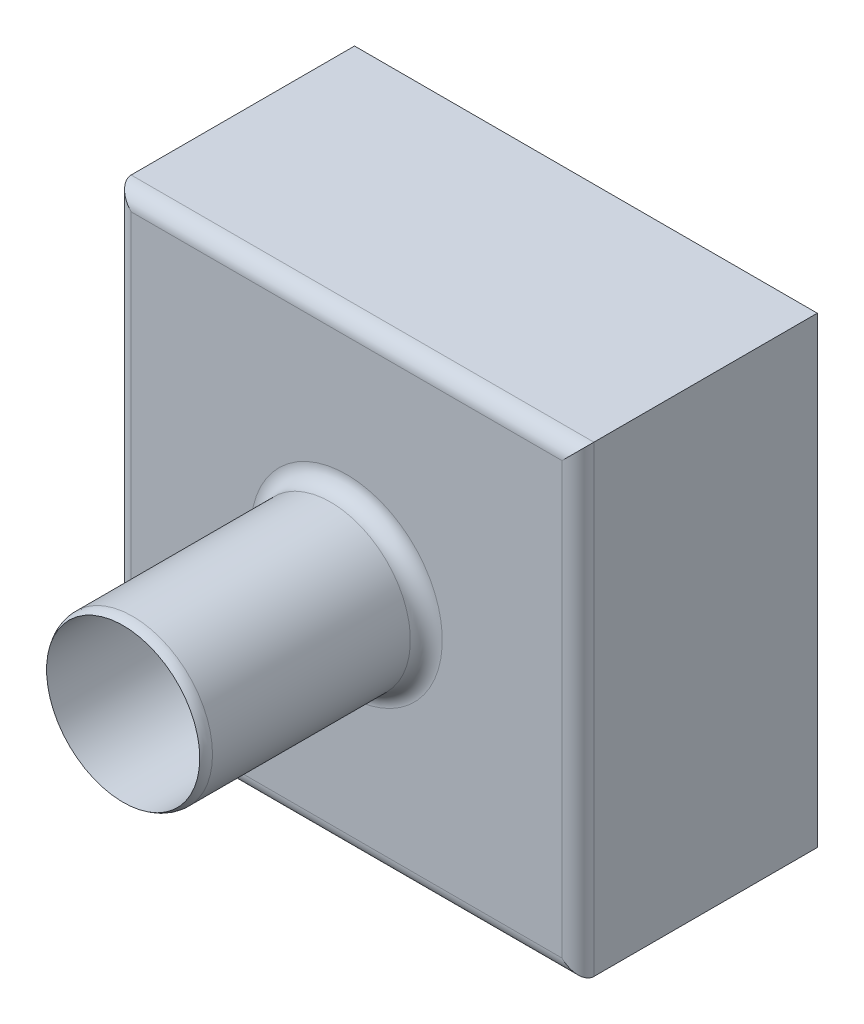
ISO-10303-21;
HEADER;
FILE_DESCRIPTION(('STEP AP214'),'2;1');
FILE_NAME('part.step','',(''),(''),'','','');
FILE_SCHEMA(('AUTOMOTIVE_DESIGN { 1 0 10303 214 1 1 1 1 }'));
ENDSEC;
DATA;
#1=APPLICATION_CONTEXT('core data for automotive mechanical design processes');
#2=APPLICATION_PROTOCOL_DEFINITION('international standard','automotive_design',2000,#1);
#3=PRODUCT_CONTEXT('',#1,'mechanical');
#4=PRODUCT('Part','Part','',(#3));
#5=PRODUCT_RELATED_PRODUCT_CATEGORY('part','',(#4));
#6=PRODUCT_DEFINITION_FORMATION('','',#4);
#7=PRODUCT_DEFINITION_CONTEXT('part definition',#1,'design');
#8=PRODUCT_DEFINITION('design','',#6,#7);
#9=PRODUCT_DEFINITION_SHAPE('','',#8);
#10=(LENGTH_UNIT() NAMED_UNIT(*) SI_UNIT(.MILLI.,.METRE.));
#11=(NAMED_UNIT(*) PLANE_ANGLE_UNIT() SI_UNIT($,.RADIAN.));
#12=(NAMED_UNIT(*) SI_UNIT($,.STERADIAN.) SOLID_ANGLE_UNIT());
#13=UNCERTAINTY_MEASURE_WITH_UNIT(LENGTH_MEASURE(1.E-05),#10,'distance_accuracy_value','');
#14=(GEOMETRIC_REPRESENTATION_CONTEXT(3) GLOBAL_UNCERTAINTY_ASSIGNED_CONTEXT((#13)) GLOBAL_UNIT_ASSIGNED_CONTEXT((#10,
#11,#12)) REPRESENTATION_CONTEXT('',''));
#15=CARTESIAN_POINT('',(0.,0.,0.));
#16=DIRECTION('',(0.,0.,1.));
#17=DIRECTION('',(1.,0.,0.));
#18=AXIS2_PLACEMENT_3D('',#15,#16,#17);
#19=CARTESIAN_POINT('',(0.,0.,15.));
#20=DIRECTION('',(-1.,0.,0.));
#21=DIRECTION('',(0.,-1.,0.));
#22=AXIS2_PLACEMENT_3D('',#19,#20,#21);
#23=PLANE('',#22);
#24=DIRECTION('',(0.,0.,-1.));
#25=VECTOR('',#24,1.);
#26=CARTESIAN_POINT('',(0.,0.,15.));
#27=LINE('',#26,#25);
#28=CARTESIAN_POINT('',(0.,0.,14.));
#29=VERTEX_POINT('',#28);
#30=CARTESIAN_POINT('',(0.,0.,0.));
#31=VERTEX_POINT('',#30);
#32=EDGE_CURVE('E178',#29,#31,#27,.T.);
#33=ORIENTED_EDGE('',*,*,#32,.F.);
#34=DIRECTION('',(0.,1.,0.));
#35=VECTOR('',#34,1.);
#36=CARTESIAN_POINT('',(0.,0.,14.));
#37=LINE('',#36,#35);
#38=CARTESIAN_POINT('',(0.,-29.,14.));
#39=VERTEX_POINT('',#38);
#40=EDGE_CURVE('E11',#29,#39,#37,.F.);
#41=ORIENTED_EDGE('',*,*,#40,.T.);
#42=DIRECTION('',(0.,0.,-1.));
#43=VECTOR('',#42,1.);
#44=CARTESIAN_POINT('',(0.,-29.,15.));
#45=LINE('',#44,#43);
#46=CARTESIAN_POINT('',(0.,-29.,0.));
#47=VERTEX_POINT('',#46);
#48=EDGE_CURVE('E200',#39,#47,#45,.T.);
#49=ORIENTED_EDGE('',*,*,#48,.T.);
#50=DIRECTION('',(0.,1.,0.));
#51=VECTOR('',#50,1.);
#52=CARTESIAN_POINT('',(0.,0.,0.));
#53=LINE('',#52,#51);
#54=EDGE_CURVE('E194',#47,#31,#53,.T.);
#55=ORIENTED_EDGE('',*,*,#54,.T.);
#56=EDGE_LOOP('',(#33,#41,#49,#55));
#57=FACE_BOUND('',#56,.T.);
#58=ADVANCED_FACE('F41',(#57),#23,.F.);
#59=CARTESIAN_POINT('',(0.,0.,15.));
#60=DIRECTION('',(0.,-1.,0.));
#61=DIRECTION('',(1.,0.,0.));
#62=AXIS2_PLACEMENT_3D('',#59,#60,#61);
#63=PLANE('',#62);
#64=DIRECTION('',(0.,0.,-1.));
#65=VECTOR('',#64,1.);
#66=CARTESIAN_POINT('',(-28.9999999999999,0.,15.));
#67=LINE('',#66,#65);
#68=CARTESIAN_POINT('',(-28.9999999999999,0.,14.));
#69=VERTEX_POINT('',#68);
#70=CARTESIAN_POINT('',(-28.9999999999999,0.,0.));
#71=VERTEX_POINT('',#70);
#72=EDGE_CURVE('E188',#69,#71,#67,.T.);
#73=ORIENTED_EDGE('',*,*,#72,.F.);
#74=DIRECTION('',(-1.,0.,0.));
#75=VECTOR('',#74,1.);
#76=CARTESIAN_POINT('',(0.,0.,14.));
#77=LINE('',#76,#75);
#78=EDGE_CURVE('E51',#69,#29,#77,.F.);
#79=ORIENTED_EDGE('',*,*,#78,.T.);
#80=ORIENTED_EDGE('',*,*,#32,.T.);
#81=DIRECTION('',(-1.,0.,0.));
#82=VECTOR('',#81,1.);
#83=CARTESIAN_POINT('',(0.,0.,0.));
#84=LINE('',#83,#82);
#85=EDGE_CURVE('E181',#31,#71,#84,.T.);
#86=ORIENTED_EDGE('',*,*,#85,.T.);
#87=EDGE_LOOP('',(#73,#79,#80,#86));
#88=FACE_BOUND('',#87,.T.);
#89=ADVANCED_FACE('F180',(#88),#63,.F.);
#90=CARTESIAN_POINT('',(-28.9999999999999,0.,15.));
#91=DIRECTION('',(1.,0.,0.));
#92=DIRECTION('',(0.,1.,0.));
#93=AXIS2_PLACEMENT_3D('',#90,#91,#92);
#94=PLANE('',#93);
#95=DIRECTION('',(0.,0.,-1.));
#96=VECTOR('',#95,1.);
#97=CARTESIAN_POINT('',(-28.9999999999999,-29.,15.));
#98=LINE('',#97,#96);
#99=CARTESIAN_POINT('',(-28.9999999999999,-29.,14.));
#100=VERTEX_POINT('',#99);
#101=CARTESIAN_POINT('',(-28.9999999999999,-29.,0.));
#102=VERTEX_POINT('',#101);
#103=EDGE_CURVE('E220',#100,#102,#98,.T.);
#104=ORIENTED_EDGE('',*,*,#103,.F.);
#105=DIRECTION('',(0.,-1.,0.));
#106=VECTOR('',#105,1.);
#107=CARTESIAN_POINT('',(-28.9999999999999,0.,14.));
#108=LINE('',#107,#106);
#109=EDGE_CURVE('E66',#100,#69,#108,.F.);
#110=ORIENTED_EDGE('',*,*,#109,.T.);
#111=ORIENTED_EDGE('',*,*,#72,.T.);
#112=DIRECTION('',(0.,-1.,0.));
#113=VECTOR('',#112,1.);
#114=CARTESIAN_POINT('',(-28.9999999999999,0.,0.));
#115=LINE('',#114,#113);
#116=EDGE_CURVE('E196',#71,#102,#115,.T.);
#117=ORIENTED_EDGE('',*,*,#116,.T.);
#118=EDGE_LOOP('',(#104,#110,#111,#117));
#119=FACE_BOUND('',#118,.T.);
#120=ADVANCED_FACE('F492',(#119),#94,.F.);
#121=CARTESIAN_POINT('',(0.,-29.,15.));
#122=DIRECTION('',(0.,1.,0.));
#123=DIRECTION('',(0.,0.,1.));
#124=AXIS2_PLACEMENT_3D('',#121,#122,#123);
#125=PLANE('',#124);
#126=ORIENTED_EDGE('',*,*,#48,.F.);
#127=DIRECTION('',(1.,0.,0.));
#128=VECTOR('',#127,1.);
#129=CARTESIAN_POINT('',(0.,-29.,14.));
#130=LINE('',#129,#128);
#131=EDGE_CURVE('E437',#39,#100,#130,.F.);
#132=ORIENTED_EDGE('',*,*,#131,.T.);
#133=ORIENTED_EDGE('',*,*,#103,.T.);
#134=DIRECTION('',(1.,0.,0.));
#135=VECTOR('',#134,1.);
#136=CARTESIAN_POINT('',(0.,-29.,0.));
#137=LINE('',#136,#135);
#138=EDGE_CURVE('E215',#102,#47,#137,.T.);
#139=ORIENTED_EDGE('',*,*,#138,.T.);
#140=EDGE_LOOP('',(#126,#132,#133,#139));
#141=FACE_BOUND('',#140,.T.);
#142=ADVANCED_FACE('F598',(#141),#125,.F.);
#143=CARTESIAN_POINT('',(0.,0.,15.));
#144=DIRECTION('',(0.,0.,-1.));
#145=DIRECTION('',(-1.,0.,0.));
#146=AXIS2_PLACEMENT_3D('',#143,#144,#145);
#147=PLANE('',#146);
#148=DIRECTION('',(0.,-1.,0.));
#149=VECTOR('',#148,1.);
#150=CARTESIAN_POINT('',(-27.9999999999999,0.,15.));
#151=LINE('',#150,#149);
#152=CARTESIAN_POINT('',(-27.9999999999999,-1.,15.));
#153=VERTEX_POINT('',#152);
#154=CARTESIAN_POINT('',(-27.9999999999999,-28.,15.));
#155=VERTEX_POINT('',#154);
#156=EDGE_CURVE('E430',#153,#155,#151,.T.);
#157=ORIENTED_EDGE('',*,*,#156,.T.);
#158=DIRECTION('',(1.,0.,0.));
#159=VECTOR('',#158,1.);
#160=CARTESIAN_POINT('',(0.,-28.,15.));
#161=LINE('',#160,#159);
#162=CARTESIAN_POINT('',(-0.999999999999996,-28.,15.));
#163=VERTEX_POINT('',#162);
#164=EDGE_CURVE('E433',#155,#163,#161,.T.);
#165=ORIENTED_EDGE('',*,*,#164,.T.);
#166=DIRECTION('',(0.,1.,0.));
#167=VECTOR('',#166,1.);
#168=CARTESIAN_POINT('',(-1.,0.,15.));
#169=LINE('',#168,#167);
#170=CARTESIAN_POINT('',(-1.,-1.,15.));
#171=VERTEX_POINT('',#170);
#172=EDGE_CURVE('E424',#163,#171,#169,.T.);
#173=ORIENTED_EDGE('',*,*,#172,.T.);
#174=DIRECTION('',(-1.,0.,0.));
#175=VECTOR('',#174,1.);
#176=CARTESIAN_POINT('',(0.,-1.,15.));
#177=LINE('',#176,#175);
#178=EDGE_CURVE('E427',#171,#153,#177,.T.);
#179=ORIENTED_EDGE('',*,*,#178,.T.);
#180=EDGE_LOOP('',(#157,#165,#173,#179));
#181=FACE_BOUND('',#180,.T.);
#182=CARTESIAN_POINT('',(-14.5,-14.5,15.));
#183=DIRECTION('',(0.,0.,-1.));
#184=DIRECTION('',(-1.,0.,0.));
#185=AXIS2_PLACEMENT_3D('',#182,#183,#184);
#186=CIRCLE('',#185,6.);
#187=CARTESIAN_POINT('',(-20.5,-14.5,15.));
#188=VERTEX_POINT('',#187);
#189=EDGE_CURVE('E420',#188,#188,#186,.T.);
#190=ORIENTED_EDGE('',*,*,#189,.T.);
#191=EDGE_LOOP('',(#190));
#192=FACE_BOUND('',#191,.T.);
#193=ADVANCED_FACE('F602',(#181,#192),#147,.F.);
#194=CARTESIAN_POINT('',(0.,0.,0.));
#195=DIRECTION('',(0.,0.,-1.));
#196=DIRECTION('',(-1.,0.,0.));
#197=AXIS2_PLACEMENT_3D('',#194,#195,#196);
#198=PLANE('',#197);
#199=CARTESIAN_POINT('',(-2.5,-6.3,0.));
#200=DIRECTION('',(0.,0.,-1.));
#201=DIRECTION('',(-1.,0.,0.));
#202=AXIS2_PLACEMENT_3D('',#199,#200,#201);
#203=CIRCLE('',#202,2.);
#204=CARTESIAN_POINT('',(-2.5,-4.3,0.));
#205=VERTEX_POINT('',#204);
#206=CARTESIAN_POINT('',(-0.499999999999997,-6.3,0.));
#207=VERTEX_POINT('',#206);
#208=EDGE_CURVE('E298',#205,#207,#203,.T.);
#209=ORIENTED_EDGE('',*,*,#208,.F.);
#210=DIRECTION('',(1.,0.,0.));
#211=VECTOR('',#210,1.);
#212=CARTESIAN_POINT('',(-23.7,-4.3,0.));
#213=LINE('',#212,#211);
#214=CARTESIAN_POINT('',(-22.7,-4.3,0.));
#215=VERTEX_POINT('',#214);
#216=EDGE_CURVE('E322',#205,#215,#213,.F.);
#217=ORIENTED_EDGE('',*,*,#216,.T.);
#218=CARTESIAN_POINT('',(-22.7,-6.3,0.));
#219=DIRECTION('',(0.,0.,-1.));
#220=DIRECTION('',(-1.,0.,0.));
#221=AXIS2_PLACEMENT_3D('',#218,#219,#220);
#222=CIRCLE('',#221,2.);
#223=CARTESIAN_POINT('',(-24.7,-6.3,0.));
#224=VERTEX_POINT('',#223);
#225=EDGE_CURVE('E319',#224,#215,#222,.T.);
#226=ORIENTED_EDGE('',*,*,#225,.F.);
#227=DIRECTION('',(0.,1.,0.));
#228=VECTOR('',#227,1.);
#229=CARTESIAN_POINT('',(-24.7,-27.5,0.));
#230=LINE('',#229,#228);
#231=CARTESIAN_POINT('',(-24.7,-26.5,0.));
#232=VERTEX_POINT('',#231);
#233=EDGE_CURVE('E316',#224,#232,#230,.F.);
#234=ORIENTED_EDGE('',*,*,#233,.T.);
#235=CARTESIAN_POINT('',(-22.7,-26.5,0.));
#236=DIRECTION('',(0.,0.,-1.));
#237=DIRECTION('',(-1.,0.,0.));
#238=AXIS2_PLACEMENT_3D('',#235,#236,#237);
#239=CIRCLE('',#238,2.);
#240=CARTESIAN_POINT('',(-22.7,-28.5,0.));
#241=VERTEX_POINT('',#240);
#242=EDGE_CURVE('E312',#241,#232,#239,.T.);
#243=ORIENTED_EDGE('',*,*,#242,.F.);
#244=DIRECTION('',(-1.,0.,0.));
#245=VECTOR('',#244,1.);
#246=CARTESIAN_POINT('',(-1.5,-28.5,0.));
#247=LINE('',#246,#245);
#248=CARTESIAN_POINT('',(-2.5,-28.5,0.));
#249=VERTEX_POINT('',#248);
#250=EDGE_CURVE('E309',#241,#249,#247,.F.);
#251=ORIENTED_EDGE('',*,*,#250,.T.);
#252=CARTESIAN_POINT('',(-2.5,-26.5,0.));
#253=DIRECTION('',(0.,0.,-1.));
#254=DIRECTION('',(-1.,0.,0.));
#255=AXIS2_PLACEMENT_3D('',#252,#253,#254);
#256=CIRCLE('',#255,2.);
#257=CARTESIAN_POINT('',(-0.499999999999999,-26.5,0.));
#258=VERTEX_POINT('',#257);
#259=EDGE_CURVE('E305',#258,#249,#256,.T.);
#260=ORIENTED_EDGE('',*,*,#259,.F.);
#261=DIRECTION('',(0.,-1.,0.));
#262=VECTOR('',#261,1.);
#263=CARTESIAN_POINT('',(-0.499999999999997,-5.3,0.));
#264=LINE('',#263,#262);
#265=EDGE_CURVE('E302',#258,#207,#264,.F.);
#266=ORIENTED_EDGE('',*,*,#265,.T.);
#267=EDGE_LOOP('',(#209,#217,#226,#234,#243,#251,#260,#266));
#268=FACE_BOUND('',#267,.T.);
#269=ORIENTED_EDGE('',*,*,#54,.F.);
#270=ORIENTED_EDGE('',*,*,#138,.F.);
#271=ORIENTED_EDGE('',*,*,#116,.F.);
#272=ORIENTED_EDGE('',*,*,#85,.F.);
#273=EDGE_LOOP('',(#269,#270,#271,#272));
#274=FACE_BOUND('',#273,.T.);
#275=ADVANCED_FACE('F192',(#268,#274),#198,.T.);
#276=CARTESIAN_POINT('',(0.,0.,13.));
#277=DIRECTION('',(0.,0.,-1.));
#278=DIRECTION('',(-1.,0.,0.));
#279=AXIS2_PLACEMENT_3D('',#276,#277,#278);
#280=PLANE('',#279);
#281=CARTESIAN_POINT('',(-14.5,-14.5,13.));
#282=DIRECTION('',(0.,0.,-1.));
#283=DIRECTION('',(-1.,0.,0.));
#284=AXIS2_PLACEMENT_3D('',#281,#282,#283);
#285=CIRCLE('',#284,6.);
#286=CARTESIAN_POINT('',(-20.5,-14.5,13.));
#287=VERTEX_POINT('',#286);
#288=EDGE_CURVE('E240',#287,#287,#285,.F.);
#289=ORIENTED_EDGE('',*,*,#288,.T.);
#290=EDGE_LOOP('',(#289));
#291=FACE_BOUND('',#290,.T.);
#292=DIRECTION('',(0.,1.,0.));
#293=VECTOR('',#292,1.);
#294=CARTESIAN_POINT('',(-22.7,0.,13.));
#295=LINE('',#294,#293);
#296=CARTESIAN_POINT('',(-22.7,-26.5,13.));
#297=VERTEX_POINT('',#296);
#298=CARTESIAN_POINT('',(-22.7,-6.3,13.));
#299=VERTEX_POINT('',#298);
#300=EDGE_CURVE('E232',#297,#299,#295,.T.);
#301=ORIENTED_EDGE('',*,*,#300,.T.);
#302=DIRECTION('',(1.,0.,0.));
#303=VECTOR('',#302,1.);
#304=CARTESIAN_POINT('',(0.,-6.3,13.));
#305=LINE('',#304,#303);
#306=CARTESIAN_POINT('',(-2.5,-6.3,13.));
#307=VERTEX_POINT('',#306);
#308=EDGE_CURVE('E236',#299,#307,#305,.T.);
#309=ORIENTED_EDGE('',*,*,#308,.T.);
#310=DIRECTION('',(0.,-1.,0.));
#311=VECTOR('',#310,1.);
#312=CARTESIAN_POINT('',(-2.5,0.,13.));
#313=LINE('',#312,#311);
#314=CARTESIAN_POINT('',(-2.5,-26.5,13.));
#315=VERTEX_POINT('',#314);
#316=EDGE_CURVE('E187',#307,#315,#313,.T.);
#317=ORIENTED_EDGE('',*,*,#316,.T.);
#318=DIRECTION('',(-1.,0.,0.));
#319=VECTOR('',#318,1.);
#320=CARTESIAN_POINT('',(0.,-26.5,13.));
#321=LINE('',#320,#319);
#322=EDGE_CURVE('E228',#315,#297,#321,.T.);
#323=ORIENTED_EDGE('',*,*,#322,.T.);
#324=EDGE_LOOP('',(#301,#309,#317,#323));
#325=FACE_BOUND('',#324,.T.);
#326=ADVANCED_FACE('F850',(#291,#325),#280,.T.);
#327=CARTESIAN_POINT('',(-1.5,-5.3,13.));
#328=DIRECTION('',(1.,0.,0.));
#329=DIRECTION('',(0.,1.,0.));
#330=AXIS2_PLACEMENT_3D('',#327,#328,#329);
#331=PLANE('',#330);
#332=DIRECTION('',(0.,-1.,0.));
#333=VECTOR('',#332,1.);
#334=CARTESIAN_POINT('',(-1.5,-5.3,12.));
#335=LINE('',#334,#333);
#336=CARTESIAN_POINT('',(-1.5,-26.5,12.));
#337=VERTEX_POINT('',#336);
#338=CARTESIAN_POINT('',(-1.5,-6.3,12.));
#339=VERTEX_POINT('',#338);
#340=EDGE_CURVE('E260',#337,#339,#335,.F.);
#341=ORIENTED_EDGE('',*,*,#340,.T.);
#342=DIRECTION('',(0.,0.,-1.));
#343=VECTOR('',#342,1.);
#344=CARTESIAN_POINT('',(-1.5,-6.3,0.));
#345=LINE('',#344,#343);
#346=CARTESIAN_POINT('',(-1.5,-6.3,0.999999999999999));
#347=VERTEX_POINT('',#346);
#348=EDGE_CURVE('E350',#339,#347,#345,.T.);
#349=ORIENTED_EDGE('',*,*,#348,.T.);
#350=DIRECTION('',(0.,-1.,0.));
#351=VECTOR('',#350,1.);
#352=CARTESIAN_POINT('',(-1.5,-27.5,0.999999999999999));
#353=LINE('',#352,#351);
#354=CARTESIAN_POINT('',(-1.5,-26.5,0.999999999999999));
#355=VERTEX_POINT('',#354);
#356=EDGE_CURVE('E347',#347,#355,#353,.T.);
#357=ORIENTED_EDGE('',*,*,#356,.T.);
#358=DIRECTION('',(0.,0.,-1.));
#359=VECTOR('',#358,1.);
#360=CARTESIAN_POINT('',(-1.5,-26.5,12.));
#361=LINE('',#360,#359);
#362=EDGE_CURVE('E344',#355,#337,#361,.F.);
#363=ORIENTED_EDGE('',*,*,#362,.T.);
#364=EDGE_LOOP('',(#341,#349,#357,#363));
#365=FACE_BOUND('',#364,.T.);
#366=ADVANCED_FACE('F840',(#365),#331,.F.);
#367=CARTESIAN_POINT('',(-1.5,-5.3,13.));
#368=DIRECTION('',(0.,1.,0.));
#369=DIRECTION('',(-1.,0.,0.));
#370=AXIS2_PLACEMENT_3D('',#367,#368,#369);
#371=PLANE('',#370);
#372=DIRECTION('',(1.,0.,0.));
#373=VECTOR('',#372,1.);
#374=CARTESIAN_POINT('',(-1.5,-5.3,12.));
#375=LINE('',#374,#373);
#376=CARTESIAN_POINT('',(-2.5,-5.3,12.));
#377=VERTEX_POINT('',#376);
#378=CARTESIAN_POINT('',(-22.7,-5.3,12.));
#379=VERTEX_POINT('',#378);
#380=EDGE_CURVE('E248',#377,#379,#375,.F.);
#381=ORIENTED_EDGE('',*,*,#380,.T.);
#382=DIRECTION('',(0.,0.,-1.));
#383=VECTOR('',#382,1.);
#384=CARTESIAN_POINT('',(-22.7,-5.3,0.));
#385=LINE('',#384,#383);
#386=CARTESIAN_POINT('',(-22.7,-5.3,0.999999999999999));
#387=VERTEX_POINT('',#386);
#388=EDGE_CURVE('E295',#379,#387,#385,.T.);
#389=ORIENTED_EDGE('',*,*,#388,.T.);
#390=DIRECTION('',(1.,0.,0.));
#391=VECTOR('',#390,1.);
#392=CARTESIAN_POINT('',(-1.5,-5.3,0.999999999999999));
#393=LINE('',#392,#391);
#394=CARTESIAN_POINT('',(-2.5,-5.3,0.999999999999999));
#395=VERTEX_POINT('',#394);
#396=EDGE_CURVE('E292',#387,#395,#393,.T.);
#397=ORIENTED_EDGE('',*,*,#396,.T.);
#398=DIRECTION('',(0.,0.,-1.));
#399=VECTOR('',#398,1.);
#400=CARTESIAN_POINT('',(-2.5,-5.3,12.));
#401=LINE('',#400,#399);
#402=EDGE_CURVE('E289',#395,#377,#401,.F.);
#403=ORIENTED_EDGE('',*,*,#402,.T.);
#404=EDGE_LOOP('',(#381,#389,#397,#403));
#405=FACE_BOUND('',#404,.T.);
#406=ADVANCED_FACE('F830',(#405),#371,.F.);
#407=CARTESIAN_POINT('',(-23.7,-5.3,13.));
#408=DIRECTION('',(-1.,0.,0.));
#409=DIRECTION('',(0.,-1.,0.));
#410=AXIS2_PLACEMENT_3D('',#407,#408,#409);
#411=PLANE('',#410);
#412=DIRECTION('',(0.,1.,0.));
#413=VECTOR('',#412,1.);
#414=CARTESIAN_POINT('',(-23.7,-5.3,0.999999999999999));
#415=LINE('',#414,#413);
#416=CARTESIAN_POINT('',(-23.7,-26.5,0.999999999999999));
#417=VERTEX_POINT('',#416);
#418=CARTESIAN_POINT('',(-23.7,-6.3,0.999999999999999));
#419=VERTEX_POINT('',#418);
#420=EDGE_CURVE('E329',#417,#419,#415,.T.);
#421=ORIENTED_EDGE('',*,*,#420,.T.);
#422=DIRECTION('',(0.,0.,-1.));
#423=VECTOR('',#422,1.);
#424=CARTESIAN_POINT('',(-23.7,-6.3,12.));
#425=LINE('',#424,#423);
#426=CARTESIAN_POINT('',(-23.7,-6.3,12.));
#427=VERTEX_POINT('',#426);
#428=EDGE_CURVE('E332',#419,#427,#425,.F.);
#429=ORIENTED_EDGE('',*,*,#428,.T.);
#430=DIRECTION('',(0.,1.,0.));
#431=VECTOR('',#430,1.);
#432=CARTESIAN_POINT('',(-23.7,-5.3,12.));
#433=LINE('',#432,#431);
#434=CARTESIAN_POINT('',(-23.7,-26.5,12.));
#435=VERTEX_POINT('',#434);
#436=EDGE_CURVE('E252',#427,#435,#433,.F.);
#437=ORIENTED_EDGE('',*,*,#436,.T.);
#438=DIRECTION('',(0.,0.,-1.));
#439=VECTOR('',#438,1.);
#440=CARTESIAN_POINT('',(-23.7,-26.5,0.));
#441=LINE('',#440,#439);
#442=EDGE_CURVE('E326',#435,#417,#441,.T.);
#443=ORIENTED_EDGE('',*,*,#442,.T.);
#444=EDGE_LOOP('',(#421,#429,#437,#443));
#445=FACE_BOUND('',#444,.T.);
#446=ADVANCED_FACE('F820',(#445),#411,.F.);
#447=CARTESIAN_POINT('',(-1.5,-27.5,13.));
#448=DIRECTION('',(0.,-1.,0.));
#449=DIRECTION('',(0.,0.,-1.));
#450=AXIS2_PLACEMENT_3D('',#447,#448,#449);
#451=PLANE('',#450);
#452=DIRECTION('',(-1.,0.,0.));
#453=VECTOR('',#452,1.);
#454=CARTESIAN_POINT('',(-23.7,-27.5,0.999999999999999));
#455=LINE('',#454,#453);
#456=CARTESIAN_POINT('',(-2.5,-27.5,0.999999999999999));
#457=VERTEX_POINT('',#456);
#458=CARTESIAN_POINT('',(-22.7,-27.5,0.999999999999999));
#459=VERTEX_POINT('',#458);
#460=EDGE_CURVE('E338',#457,#459,#455,.T.);
#461=ORIENTED_EDGE('',*,*,#460,.T.);
#462=DIRECTION('',(0.,0.,-1.));
#463=VECTOR('',#462,1.);
#464=CARTESIAN_POINT('',(-22.7,-27.5,12.));
#465=LINE('',#464,#463);
#466=CARTESIAN_POINT('',(-22.7,-27.5,12.));
#467=VERTEX_POINT('',#466);
#468=EDGE_CURVE('E341',#459,#467,#465,.F.);
#469=ORIENTED_EDGE('',*,*,#468,.T.);
#470=DIRECTION('',(-1.,0.,0.));
#471=VECTOR('',#470,1.);
#472=CARTESIAN_POINT('',(-1.5,-27.5,12.));
#473=LINE('',#472,#471);
#474=CARTESIAN_POINT('',(-2.5,-27.5,12.));
#475=VERTEX_POINT('',#474);
#476=EDGE_CURVE('E256',#467,#475,#473,.F.);
#477=ORIENTED_EDGE('',*,*,#476,.T.);
#478=DIRECTION('',(0.,0.,-1.));
#479=VECTOR('',#478,1.);
#480=CARTESIAN_POINT('',(-2.5,-27.5,0.));
#481=LINE('',#480,#479);
#482=EDGE_CURVE('E335',#475,#457,#481,.T.);
#483=ORIENTED_EDGE('',*,*,#482,.T.);
#484=EDGE_LOOP('',(#461,#469,#477,#483));
#485=FACE_BOUND('',#484,.T.);
#486=ADVANCED_FACE('F500',(#485),#451,.F.);
#487=CARTESIAN_POINT('',(-14.5,-14.5,14.));
#488=DIRECTION('',(0.,0.,-1.));
#489=DIRECTION('',(-1.,0.,0.));
#490=AXIS2_PLACEMENT_3D('',#487,#488,#489);
#491=TOROIDAL_SURFACE('',#490,6.,1.);
#492=CARTESIAN_POINT('',(-14.5,-14.5,14.));
#493=DIRECTION('',(0.,0.,-1.));
#494=DIRECTION('',(-1.,0.,0.));
#495=AXIS2_PLACEMENT_3D('',#492,#493,#494);
#496=CIRCLE('',#495,5.);
#497=CARTESIAN_POINT('',(-19.5,-14.5,14.));
#498=VERTEX_POINT('',#497);
#499=EDGE_CURVE('E244',#498,#498,#496,.T.);
#500=ORIENTED_EDGE('',*,*,#499,.F.);
#501=EDGE_LOOP('',(#500));
#502=FACE_BOUND('',#501,.T.);
#503=ORIENTED_EDGE('',*,*,#288,.F.);
#504=EDGE_LOOP('',(#503));
#505=FACE_BOUND('',#504,.T.);
#506=ADVANCED_FACE('F496',(#502,#505),#491,.T.);
#507=CARTESIAN_POINT('',(0.,-26.5,12.));
#508=DIRECTION('',(-1.,0.,0.));
#509=DIRECTION('',(0.,0.,1.));
#510=AXIS2_PLACEMENT_3D('',#507,#508,#509);
#511=CYLINDRICAL_SURFACE('',#510,1.);
#512=ORIENTED_EDGE('',*,*,#476,.F.);
#513=CARTESIAN_POINT('',(-22.7,-26.5,12.));
#514=DIRECTION('',(-1.,0.,0.));
#515=DIRECTION('',(0.,0.,1.));
#516=AXIS2_PLACEMENT_3D('',#513,#514,#515);
#517=CIRCLE('',#516,1.);
#518=EDGE_CURVE('E280',#467,#297,#517,.T.);
#519=ORIENTED_EDGE('',*,*,#518,.T.);
#520=ORIENTED_EDGE('',*,*,#322,.F.);
#521=CARTESIAN_POINT('',(-2.5,-26.5,12.));
#522=DIRECTION('',(-1.,0.,0.));
#523=DIRECTION('',(0.,0.,1.));
#524=AXIS2_PLACEMENT_3D('',#521,#522,#523);
#525=CIRCLE('',#524,1.);
#526=EDGE_CURVE('E277',#315,#475,#525,.F.);
#527=ORIENTED_EDGE('',*,*,#526,.T.);
#528=EDGE_LOOP('',(#512,#519,#520,#527));
#529=FACE_BOUND('',#528,.T.);
#530=ADVANCED_FACE('F499',(#529),#511,.F.);
#531=CARTESIAN_POINT('',(-22.7,0.,12.));
#532=DIRECTION('',(0.,1.,0.));
#533=DIRECTION('',(-1.,0.,0.));
#534=AXIS2_PLACEMENT_3D('',#531,#532,#533);
#535=CYLINDRICAL_SURFACE('',#534,1.);
#536=ORIENTED_EDGE('',*,*,#436,.F.);
#537=CARTESIAN_POINT('',(-22.7,-6.3,12.));
#538=DIRECTION('',(0.,1.,0.));
#539=DIRECTION('',(-1.,0.,0.));
#540=AXIS2_PLACEMENT_3D('',#537,#538,#539);
#541=CIRCLE('',#540,1.);
#542=EDGE_CURVE('E274',#427,#299,#541,.T.);
#543=ORIENTED_EDGE('',*,*,#542,.T.);
#544=ORIENTED_EDGE('',*,*,#300,.F.);
#545=CARTESIAN_POINT('',(-22.7,-26.5,12.));
#546=DIRECTION('',(0.,1.,0.));
#547=DIRECTION('',(-1.,0.,0.));
#548=AXIS2_PLACEMENT_3D('',#545,#546,#547);
#549=CIRCLE('',#548,1.);
#550=EDGE_CURVE('E271',#297,#435,#549,.F.);
#551=ORIENTED_EDGE('',*,*,#550,.T.);
#552=EDGE_LOOP('',(#536,#543,#544,#551));
#553=FACE_BOUND('',#552,.T.);
#554=ADVANCED_FACE('F510',(#553),#535,.F.);
#555=CARTESIAN_POINT('',(-2.5,0.,12.));
#556=DIRECTION('',(0.,-1.,0.));
#557=DIRECTION('',(1.,0.,0.));
#558=AXIS2_PLACEMENT_3D('',#555,#556,#557);
#559=CYLINDRICAL_SURFACE('',#558,1.);
#560=ORIENTED_EDGE('',*,*,#316,.F.);
#561=CARTESIAN_POINT('',(-2.5,-6.3,12.));
#562=DIRECTION('',(0.,-1.,0.));
#563=DIRECTION('',(1.,0.,0.));
#564=AXIS2_PLACEMENT_3D('',#561,#562,#563);
#565=CIRCLE('',#564,1.);
#566=EDGE_CURVE('E286',#307,#339,#565,.F.);
#567=ORIENTED_EDGE('',*,*,#566,.T.);
#568=ORIENTED_EDGE('',*,*,#340,.F.);
#569=CARTESIAN_POINT('',(-2.5,-26.5,12.));
#570=DIRECTION('',(0.,-1.,0.));
#571=DIRECTION('',(1.,0.,0.));
#572=AXIS2_PLACEMENT_3D('',#569,#570,#571);
#573=CIRCLE('',#572,1.);
#574=EDGE_CURVE('E283',#337,#315,#573,.T.);
#575=ORIENTED_EDGE('',*,*,#574,.T.);
#576=EDGE_LOOP('',(#560,#567,#568,#575));
#577=FACE_BOUND('',#576,.T.);
#578=ADVANCED_FACE('F506',(#577),#559,.F.);
#579=CARTESIAN_POINT('',(0.,-6.3,12.));
#580=DIRECTION('',(1.,0.,0.));
#581=DIRECTION('',(0.,1.,0.));
#582=AXIS2_PLACEMENT_3D('',#579,#580,#581);
#583=CYLINDRICAL_SURFACE('',#582,1.);
#584=ORIENTED_EDGE('',*,*,#308,.F.);
#585=CARTESIAN_POINT('',(-22.7,-6.3,12.));
#586=DIRECTION('',(1.,0.,0.));
#587=DIRECTION('',(0.,1.,0.));
#588=AXIS2_PLACEMENT_3D('',#585,#586,#587);
#589=CIRCLE('',#588,1.);
#590=EDGE_CURVE('E267',#299,#379,#589,.F.);
#591=ORIENTED_EDGE('',*,*,#590,.T.);
#592=ORIENTED_EDGE('',*,*,#380,.F.);
#593=CARTESIAN_POINT('',(-2.5,-6.3,12.));
#594=DIRECTION('',(1.,0.,0.));
#595=DIRECTION('',(0.,1.,0.));
#596=AXIS2_PLACEMENT_3D('',#593,#594,#595);
#597=CIRCLE('',#596,1.);
#598=EDGE_CURVE('E264',#377,#307,#597,.T.);
#599=ORIENTED_EDGE('',*,*,#598,.T.);
#600=EDGE_LOOP('',(#584,#591,#592,#599));
#601=FACE_BOUND('',#600,.T.);
#602=ADVANCED_FACE('F502',(#601),#583,.F.);
#603=CARTESIAN_POINT('',(-2.5,-26.5,12.));
#604=DIRECTION('',(0.,0.,1.));
#605=DIRECTION('',(1.,0.,0.));
#606=AXIS2_PLACEMENT_3D('',#603,#604,#605);
#607=SPHERICAL_SURFACE('',#606,1.);
#608=ORIENTED_EDGE('',*,*,#526,.F.);
#609=ORIENTED_EDGE('',*,*,#574,.F.);
#610=CARTESIAN_POINT('',(-2.5,-26.5,12.));
#611=DIRECTION('',(0.,0.,1.));
#612=DIRECTION('',(1.,0.,0.));
#613=AXIS2_PLACEMENT_3D('',#610,#611,#612);
#614=CIRCLE('',#613,1.);
#615=EDGE_CURVE('E203',#475,#337,#614,.T.);
#616=ORIENTED_EDGE('',*,*,#615,.F.);
#617=EDGE_LOOP('',(#608,#609,#616));
#618=FACE_BOUND('',#617,.T.);
#619=ADVANCED_FACE('F505',(#618),#607,.F.);
#620=CARTESIAN_POINT('',(-2.5,-26.5,13.));
#621=DIRECTION('',(0.,0.,1.));
#622=DIRECTION('',(1.,0.,0.));
#623=AXIS2_PLACEMENT_3D('',#620,#621,#622);
#624=CYLINDRICAL_SURFACE('',#623,1.);
#625=ORIENTED_EDGE('',*,*,#615,.T.);
#626=ORIENTED_EDGE('',*,*,#362,.F.);
#627=CARTESIAN_POINT('',(-2.5,-26.5,0.999999999999999));
#628=DIRECTION('',(0.,0.,-1.));
#629=DIRECTION('',(-1.,0.,0.));
#630=AXIS2_PLACEMENT_3D('',#627,#628,#629);
#631=CIRCLE('',#630,1.);
#632=EDGE_CURVE('E207',#457,#355,#631,.F.);
#633=ORIENTED_EDGE('',*,*,#632,.F.);
#634=ORIENTED_EDGE('',*,*,#482,.F.);
#635=EDGE_LOOP('',(#625,#626,#633,#634));
#636=FACE_BOUND('',#635,.T.);
#637=ADVANCED_FACE('F573',(#636),#624,.F.);
#638=CARTESIAN_POINT('',(-2.5,-6.3,12.));
#639=DIRECTION('',(0.,0.,1.));
#640=DIRECTION('',(1.,0.,0.));
#641=AXIS2_PLACEMENT_3D('',#638,#639,#640);
#642=SPHERICAL_SURFACE('',#641,1.);
#643=ORIENTED_EDGE('',*,*,#566,.F.);
#644=ORIENTED_EDGE('',*,*,#598,.F.);
#645=CARTESIAN_POINT('',(-2.5,-6.3,12.));
#646=DIRECTION('',(0.,0.,1.));
#647=DIRECTION('',(1.,0.,0.));
#648=AXIS2_PLACEMENT_3D('',#645,#646,#647);
#649=CIRCLE('',#648,1.);
#650=EDGE_CURVE('E406',#339,#377,#649,.T.);
#651=ORIENTED_EDGE('',*,*,#650,.F.);
#652=EDGE_LOOP('',(#643,#644,#651));
#653=FACE_BOUND('',#652,.T.);
#654=ADVANCED_FACE('F569',(#653),#642,.F.);
#655=CARTESIAN_POINT('',(-2.5,-26.5,0.999999999999999));
#656=DIRECTION('',(0.,0.,-1.));
#657=DIRECTION('',(-1.,0.,0.));
#658=AXIS2_PLACEMENT_3D('',#655,#656,#657);
#659=TOROIDAL_SURFACE('',#658,2.,1.);
#660=CARTESIAN_POINT('',(-2.5,-28.5,1.));
#661=DIRECTION('',(1.,0.,0.));
#662=DIRECTION('',(0.,0.,-1.));
#663=AXIS2_PLACEMENT_3D('',#660,#661,#662);
#664=CIRCLE('',#663,1.);
#665=EDGE_CURVE('E398',#457,#249,#664,.F.);
#666=ORIENTED_EDGE('',*,*,#665,.F.);
#667=ORIENTED_EDGE('',*,*,#632,.T.);
#668=CARTESIAN_POINT('',(-0.499999999999999,-26.5,0.999999999999999));
#669=DIRECTION('',(0.,-1.,0.));
#670=DIRECTION('',(0.,0.,-1.));
#671=AXIS2_PLACEMENT_3D('',#668,#669,#670);
#672=CIRCLE('',#671,1.);
#673=EDGE_CURVE('E402',#258,#355,#672,.F.);
#674=ORIENTED_EDGE('',*,*,#673,.F.);
#675=ORIENTED_EDGE('',*,*,#259,.T.);
#676=EDGE_LOOP('',(#666,#667,#674,#675));
#677=FACE_BOUND('',#676,.T.);
#678=ADVANCED_FACE('F565',(#677),#659,.T.);
#679=CARTESIAN_POINT('',(-22.7,-26.5,12.));
#680=DIRECTION('',(0.,0.,1.));
#681=DIRECTION('',(1.,0.,0.));
#682=AXIS2_PLACEMENT_3D('',#679,#680,#681);
#683=SPHERICAL_SURFACE('',#682,1.);
#684=ORIENTED_EDGE('',*,*,#550,.F.);
#685=ORIENTED_EDGE('',*,*,#518,.F.);
#686=CARTESIAN_POINT('',(-22.7,-26.5,12.));
#687=DIRECTION('',(0.,0.,1.));
#688=DIRECTION('',(1.,0.,0.));
#689=AXIS2_PLACEMENT_3D('',#686,#687,#688);
#690=CIRCLE('',#689,1.);
#691=EDGE_CURVE('E394',#435,#467,#690,.T.);
#692=ORIENTED_EDGE('',*,*,#691,.F.);
#693=EDGE_LOOP('',(#684,#685,#692));
#694=FACE_BOUND('',#693,.T.);
#695=ADVANCED_FACE('F561',(#694),#683,.F.);
#696=CARTESIAN_POINT('',(-2.5,-6.3,13.));
#697=DIRECTION('',(0.,0.,1.));
#698=DIRECTION('',(1.,0.,0.));
#699=AXIS2_PLACEMENT_3D('',#696,#697,#698);
#700=CYLINDRICAL_SURFACE('',#699,1.);
#701=ORIENTED_EDGE('',*,*,#650,.T.);
#702=ORIENTED_EDGE('',*,*,#402,.F.);
#703=CARTESIAN_POINT('',(-2.5,-6.3,0.999999999999999));
#704=DIRECTION('',(0.,0.,-1.));
#705=DIRECTION('',(-1.,0.,0.));
#706=AXIS2_PLACEMENT_3D('',#703,#704,#705);
#707=CIRCLE('',#706,1.);
#708=EDGE_CURVE('E390',#347,#395,#707,.F.);
#709=ORIENTED_EDGE('',*,*,#708,.F.);
#710=ORIENTED_EDGE('',*,*,#348,.F.);
#711=EDGE_LOOP('',(#701,#702,#709,#710));
#712=FACE_BOUND('',#711,.T.);
#713=ADVANCED_FACE('F557',(#712),#700,.F.);
#714=CARTESIAN_POINT('',(-0.499999999999997,-5.3,0.999999999999999));
#715=DIRECTION('',(0.,1.,0.));
#716=DIRECTION('',(-1.,0.,0.));
#717=AXIS2_PLACEMENT_3D('',#714,#715,#716);
#718=CYLINDRICAL_SURFACE('',#717,1.);
#719=ORIENTED_EDGE('',*,*,#673,.T.);
#720=ORIENTED_EDGE('',*,*,#356,.F.);
#721=CARTESIAN_POINT('',(-0.499999999999997,-6.3,1.));
#722=DIRECTION('',(0.,1.,0.));
#723=DIRECTION('',(0.,0.,1.));
#724=AXIS2_PLACEMENT_3D('',#721,#722,#723);
#725=CIRCLE('',#724,1.);
#726=EDGE_CURVE('E386',#207,#347,#725,.T.);
#727=ORIENTED_EDGE('',*,*,#726,.F.);
#728=ORIENTED_EDGE('',*,*,#265,.F.);
#729=EDGE_LOOP('',(#719,#720,#727,#728));
#730=FACE_BOUND('',#729,.T.);
#731=ADVANCED_FACE('F553',(#730),#718,.T.);
#732=CARTESIAN_POINT('',(-1.5,-28.5,0.999999999999999));
#733=DIRECTION('',(1.,0.,0.));
#734=DIRECTION('',(0.,0.,-1.));
#735=AXIS2_PLACEMENT_3D('',#732,#733,#734);
#736=CYLINDRICAL_SURFACE('',#735,1.);
#737=ORIENTED_EDGE('',*,*,#665,.T.);
#738=ORIENTED_EDGE('',*,*,#250,.F.);
#739=CARTESIAN_POINT('',(-22.7,-28.5,0.999999999999999));
#740=DIRECTION('',(-1.,0.,0.));
#741=DIRECTION('',(0.,0.,1.));
#742=AXIS2_PLACEMENT_3D('',#739,#740,#741);
#743=CIRCLE('',#742,1.);
#744=EDGE_CURVE('E382',#459,#241,#743,.T.);
#745=ORIENTED_EDGE('',*,*,#744,.F.);
#746=ORIENTED_EDGE('',*,*,#460,.F.);
#747=EDGE_LOOP('',(#737,#738,#745,#746));
#748=FACE_BOUND('',#747,.T.);
#749=ADVANCED_FACE('F549',(#748),#736,.T.);
#750=CARTESIAN_POINT('',(-22.7,-26.5,13.));
#751=DIRECTION('',(0.,0.,1.));
#752=DIRECTION('',(1.,0.,0.));
#753=AXIS2_PLACEMENT_3D('',#750,#751,#752);
#754=CYLINDRICAL_SURFACE('',#753,1.);
#755=ORIENTED_EDGE('',*,*,#691,.T.);
#756=ORIENTED_EDGE('',*,*,#468,.F.);
#757=CARTESIAN_POINT('',(-22.7,-26.5,0.999999999999999));
#758=DIRECTION('',(0.,0.,-1.));
#759=DIRECTION('',(-1.,0.,0.));
#760=AXIS2_PLACEMENT_3D('',#757,#758,#759);
#761=CIRCLE('',#760,1.);
#762=EDGE_CURVE('E378',#417,#459,#761,.F.);
#763=ORIENTED_EDGE('',*,*,#762,.F.);
#764=ORIENTED_EDGE('',*,*,#442,.F.);
#765=EDGE_LOOP('',(#755,#756,#763,#764));
#766=FACE_BOUND('',#765,.T.);
#767=ADVANCED_FACE('F545',(#766),#754,.F.);
#768=CARTESIAN_POINT('',(-2.5,-6.3,0.999999999999999));
#769=DIRECTION('',(0.,0.,-1.));
#770=DIRECTION('',(-1.,0.,0.));
#771=AXIS2_PLACEMENT_3D('',#768,#769,#770);
#772=TOROIDAL_SURFACE('',#771,2.,1.);
#773=ORIENTED_EDGE('',*,*,#726,.T.);
#774=ORIENTED_EDGE('',*,*,#708,.T.);
#775=CARTESIAN_POINT('',(-2.5,-4.3,0.999999999999999));
#776=DIRECTION('',(1.,0.,0.));
#777=DIRECTION('',(0.,0.,-1.));
#778=AXIS2_PLACEMENT_3D('',#775,#776,#777);
#779=CIRCLE('',#778,1.);
#780=EDGE_CURVE('E374',#205,#395,#779,.F.);
#781=ORIENTED_EDGE('',*,*,#780,.F.);
#782=ORIENTED_EDGE('',*,*,#208,.T.);
#783=EDGE_LOOP('',(#773,#774,#781,#782));
#784=FACE_BOUND('',#783,.T.);
#785=ADVANCED_FACE('F541',(#784),#772,.T.);
#786=CARTESIAN_POINT('',(-22.7,-26.5,0.999999999999999));
#787=DIRECTION('',(0.,0.,-1.));
#788=DIRECTION('',(-1.,0.,0.));
#789=AXIS2_PLACEMENT_3D('',#786,#787,#788);
#790=TOROIDAL_SURFACE('',#789,2.,1.);
#791=ORIENTED_EDGE('',*,*,#744,.T.);
#792=ORIENTED_EDGE('',*,*,#242,.T.);
#793=CARTESIAN_POINT('',(-24.7,-26.5,1.));
#794=DIRECTION('',(0.,-1.,0.));
#795=DIRECTION('',(0.,0.,-1.));
#796=AXIS2_PLACEMENT_3D('',#793,#794,#795);
#797=CIRCLE('',#796,1.);
#798=EDGE_CURVE('E370',#417,#232,#797,.F.);
#799=ORIENTED_EDGE('',*,*,#798,.F.);
#800=ORIENTED_EDGE('',*,*,#762,.T.);
#801=EDGE_LOOP('',(#791,#792,#799,#800));
#802=FACE_BOUND('',#801,.T.);
#803=ADVANCED_FACE('F537',(#802),#790,.T.);
#804=CARTESIAN_POINT('',(-1.5,-4.3,0.999999999999999));
#805=DIRECTION('',(-1.,0.,0.));
#806=DIRECTION('',(0.,-1.,0.));
#807=AXIS2_PLACEMENT_3D('',#804,#805,#806);
#808=CYLINDRICAL_SURFACE('',#807,1.);
#809=ORIENTED_EDGE('',*,*,#780,.T.);
#810=ORIENTED_EDGE('',*,*,#396,.F.);
#811=CARTESIAN_POINT('',(-22.7,-4.3,1.));
#812=DIRECTION('',(-1.,0.,0.));
#813=DIRECTION('',(0.,0.,1.));
#814=AXIS2_PLACEMENT_3D('',#811,#812,#813);
#815=CIRCLE('',#814,1.);
#816=EDGE_CURVE('E366',#215,#387,#815,.T.);
#817=ORIENTED_EDGE('',*,*,#816,.F.);
#818=ORIENTED_EDGE('',*,*,#216,.F.);
#819=EDGE_LOOP('',(#809,#810,#817,#818));
#820=FACE_BOUND('',#819,.T.);
#821=ADVANCED_FACE('F533',(#820),#808,.T.);
#822=CARTESIAN_POINT('',(-24.7,-5.3,0.999999999999999));
#823=DIRECTION('',(0.,-1.,0.));
#824=DIRECTION('',(1.,0.,0.));
#825=AXIS2_PLACEMENT_3D('',#822,#823,#824);
#826=CYLINDRICAL_SURFACE('',#825,1.);
#827=ORIENTED_EDGE('',*,*,#798,.T.);
#828=ORIENTED_EDGE('',*,*,#233,.F.);
#829=CARTESIAN_POINT('',(-24.7,-6.3,0.999999999999999));
#830=DIRECTION('',(0.,1.,0.));
#831=DIRECTION('',(0.,0.,1.));
#832=AXIS2_PLACEMENT_3D('',#829,#830,#831);
#833=CIRCLE('',#832,1.);
#834=EDGE_CURVE('E362',#419,#224,#833,.T.);
#835=ORIENTED_EDGE('',*,*,#834,.F.);
#836=ORIENTED_EDGE('',*,*,#420,.F.);
#837=EDGE_LOOP('',(#827,#828,#835,#836));
#838=FACE_BOUND('',#837,.T.);
#839=ADVANCED_FACE('F529',(#838),#826,.T.);
#840=CARTESIAN_POINT('',(-22.7,-6.3,0.999999999999999));
#841=DIRECTION('',(0.,0.,-1.));
#842=DIRECTION('',(-1.,0.,0.));
#843=AXIS2_PLACEMENT_3D('',#840,#841,#842);
#844=TOROIDAL_SURFACE('',#843,2.,1.);
#845=ORIENTED_EDGE('',*,*,#225,.T.);
#846=ORIENTED_EDGE('',*,*,#816,.T.);
#847=CARTESIAN_POINT('',(-22.7,-6.3,0.999999999999999));
#848=DIRECTION('',(0.,0.,-1.));
#849=DIRECTION('',(-1.,0.,0.));
#850=AXIS2_PLACEMENT_3D('',#847,#848,#849);
#851=CIRCLE('',#850,1.);
#852=EDGE_CURVE('E357',#419,#387,#851,.T.);
#853=ORIENTED_EDGE('',*,*,#852,.F.);
#854=ORIENTED_EDGE('',*,*,#834,.T.);
#855=EDGE_LOOP('',(#845,#846,#853,#854));
#856=FACE_BOUND('',#855,.T.);
#857=ADVANCED_FACE('F525',(#856),#844,.T.);
#858=CARTESIAN_POINT('',(-22.7,-6.3,13.));
#859=DIRECTION('',(0.,0.,1.));
#860=DIRECTION('',(1.,0.,0.));
#861=AXIS2_PLACEMENT_3D('',#858,#859,#860);
#862=CYLINDRICAL_SURFACE('',#861,1.);
#863=ORIENTED_EDGE('',*,*,#852,.T.);
#864=ORIENTED_EDGE('',*,*,#388,.F.);
#865=CARTESIAN_POINT('',(-22.7,-6.3,12.));
#866=DIRECTION('',(0.,0.,-1.));
#867=DIRECTION('',(-1.,0.,0.));
#868=AXIS2_PLACEMENT_3D('',#865,#866,#867);
#869=CIRCLE('',#868,1.);
#870=EDGE_CURVE('E354',#427,#379,#869,.T.);
#871=ORIENTED_EDGE('',*,*,#870,.F.);
#872=ORIENTED_EDGE('',*,*,#428,.F.);
#873=EDGE_LOOP('',(#863,#864,#871,#872));
#874=FACE_BOUND('',#873,.T.);
#875=ADVANCED_FACE('F521',(#874),#862,.F.);
#876=CARTESIAN_POINT('',(-22.7,-6.3,12.));
#877=DIRECTION('',(0.,0.,1.));
#878=DIRECTION('',(1.,0.,0.));
#879=AXIS2_PLACEMENT_3D('',#876,#877,#878);
#880=SPHERICAL_SURFACE('',#879,1.);
#881=ORIENTED_EDGE('',*,*,#590,.F.);
#882=ORIENTED_EDGE('',*,*,#542,.F.);
#883=ORIENTED_EDGE('',*,*,#870,.T.);
#884=EDGE_LOOP('',(#881,#882,#883));
#885=FACE_BOUND('',#884,.T.);
#886=ADVANCED_FACE('F518',(#885),#880,.F.);
#887=CARTESIAN_POINT('',(-14.5,-14.5,14.));
#888=DIRECTION('',(0.,0.,1.));
#889=DIRECTION('',(1.,0.,0.));
#890=AXIS2_PLACEMENT_3D('',#887,#888,#889);
#891=PLANE('',#890);
#892=CARTESIAN_POINT('',(-14.5,-14.5,14.));
#893=DIRECTION('',(0.,0.,1.));
#894=DIRECTION('',(1.,0.,0.));
#895=AXIS2_PLACEMENT_3D('',#892,#893,#894);
#896=CIRCLE('',#895,4.8);
#897=CARTESIAN_POINT('',(-9.7,-14.5,14.));
#898=VERTEX_POINT('',#897);
#899=EDGE_CURVE('E358',#898,#898,#896,.T.);
#900=ORIENTED_EDGE('',*,*,#899,.T.);
#901=EDGE_LOOP('',(#900));
#902=FACE_BOUND('',#901,.T.);
#903=ORIENTED_EDGE('',*,*,#499,.T.);
#904=EDGE_LOOP('',(#903));
#905=FACE_BOUND('',#904,.T.);
#906=ADVANCED_FACE('F469',(#902,#905),#891,.F.);
#907=CARTESIAN_POINT('',(-14.5,-14.5,29.));
#908=DIRECTION('',(0.,0.,-1.));
#909=DIRECTION('',(-1.,0.,0.));
#910=AXIS2_PLACEMENT_3D('',#907,#908,#909);
#911=CYLINDRICAL_SURFACE('',#910,5.);
#912=CARTESIAN_POINT('',(-14.5,-14.5,28.4));
#913=DIRECTION('',(0.,0.,1.));
#914=DIRECTION('',(1.,0.,0.));
#915=AXIS2_PLACEMENT_3D('',#912,#913,#914);
#916=CIRCLE('',#915,5.);
#917=CARTESIAN_POINT('',(-9.49999999999999,-14.5,28.4));
#918=VERTEX_POINT('',#917);
#919=EDGE_CURVE('E416',#918,#918,#916,.F.);
#920=ORIENTED_EDGE('',*,*,#919,.T.);
#921=EDGE_LOOP('',(#920));
#922=FACE_BOUND('',#921,.T.);
#923=CARTESIAN_POINT('',(-14.5,-14.5,16.));
#924=DIRECTION('',(0.,0.,-1.));
#925=DIRECTION('',(-1.,0.,0.));
#926=AXIS2_PLACEMENT_3D('',#923,#924,#925);
#927=CIRCLE('',#926,5.);
#928=CARTESIAN_POINT('',(-19.5,-14.5,16.));
#929=VERTEX_POINT('',#928);
#930=EDGE_CURVE('E353',#929,#929,#927,.F.);
#931=ORIENTED_EDGE('',*,*,#930,.T.);
#932=EDGE_LOOP('',(#931));
#933=FACE_BOUND('',#932,.T.);
#934=ADVANCED_FACE('F475',(#922,#933),#911,.T.);
#935=CARTESIAN_POINT('',(-14.5,-14.5,14.));
#936=DIRECTION('',(0.,0.,1.));
#937=DIRECTION('',(1.,0.,0.));
#938=AXIS2_PLACEMENT_3D('',#935,#936,#937);
#939=CYLINDRICAL_SURFACE('',#938,4.8);
#940=ORIENTED_EDGE('',*,*,#899,.F.);
#941=EDGE_LOOP('',(#940));
#942=FACE_BOUND('',#941,.T.);
#943=CARTESIAN_POINT('',(-14.5,-14.5,29.));
#944=DIRECTION('',(0.,0.,1.));
#945=DIRECTION('',(1.,0.,0.));
#946=AXIS2_PLACEMENT_3D('',#943,#944,#945);
#947=CIRCLE('',#946,4.8);
#948=CARTESIAN_POINT('',(-9.7,-14.5,29.));
#949=VERTEX_POINT('',#948);
#950=EDGE_CURVE('E210',#949,#949,#947,.T.);
#951=ORIENTED_EDGE('',*,*,#950,.T.);
#952=EDGE_LOOP('',(#951));
#953=FACE_BOUND('',#952,.T.);
#954=ADVANCED_FACE('F472',(#942,#953),#939,.F.);
#955=CARTESIAN_POINT('',(-14.5,-14.5,28.4));
#956=DIRECTION('',(0.,0.,1.));
#957=DIRECTION('',(1.,0.,0.));
#958=AXIS2_PLACEMENT_3D('',#955,#956,#957);
#959=TOROIDAL_SURFACE('',#958,4.,1.);
#960=ORIENTED_EDGE('',*,*,#919,.F.);
#961=EDGE_LOOP('',(#960));
#962=FACE_BOUND('',#961,.T.);
#963=ORIENTED_EDGE('',*,*,#950,.F.);
#964=EDGE_LOOP('',(#963));
#965=FACE_BOUND('',#964,.T.);
#966=ADVANCED_FACE('F474',(#962,#965),#959,.T.);
#967=CARTESIAN_POINT('',(0.,-1.,14.));
#968=DIRECTION('',(-1.,0.,0.));
#969=DIRECTION('',(0.,-1.,0.));
#970=AXIS2_PLACEMENT_3D('',#967,#968,#969);
#971=CYLINDRICAL_SURFACE('',#970,1.);
#972=CARTESIAN_POINT('',(-1.,-1.,14.));
#973=DIRECTION('',(-0.707106781186548,0.707106781186547,0.));
#974=DIRECTION('',(0.707106781186547,0.707106781186548,0.));
#975=AXIS2_PLACEMENT_3D('',#972,#973,#974);
#976=ELLIPSE('',#975,1.41421356237309,1.);
#977=EDGE_CURVE('E450',#29,#171,#976,.F.);
#978=ORIENTED_EDGE('',*,*,#977,.F.);
#979=ORIENTED_EDGE('',*,*,#78,.F.);
#980=CARTESIAN_POINT('',(-27.9999999999999,-1.,14.));
#981=DIRECTION('',(-0.707106781186548,-0.707106781186547,0.));
#982=DIRECTION('',(-0.707106781186547,0.707106781186547,0.));
#983=AXIS2_PLACEMENT_3D('',#980,#981,#982);
#984=ELLIPSE('',#983,1.41421356237309,1.);
#985=EDGE_CURVE('E45',#153,#69,#984,.T.);
#986=ORIENTED_EDGE('',*,*,#985,.F.);
#987=ORIENTED_EDGE('',*,*,#178,.F.);
#988=EDGE_LOOP('',(#978,#979,#986,#987));
#989=FACE_BOUND('',#988,.T.);
#990=ADVANCED_FACE('F481',(#989),#971,.T.);
#991=CARTESIAN_POINT('',(-27.9999999999999,0.,14.));
#992=DIRECTION('',(0.,-1.,0.));
#993=DIRECTION('',(1.,0.,0.));
#994=AXIS2_PLACEMENT_3D('',#991,#992,#993);
#995=CYLINDRICAL_SURFACE('',#994,1.);
#996=ORIENTED_EDGE('',*,*,#985,.T.);
#997=ORIENTED_EDGE('',*,*,#109,.F.);
#998=CARTESIAN_POINT('',(-27.9999999999999,-28.,14.));
#999=DIRECTION('',(0.707106781186547,-0.707106781186548,0.));
#1000=DIRECTION('',(-0.707106781186548,-0.707106781186547,0.));
#1001=AXIS2_PLACEMENT_3D('',#998,#999,#1000);
#1002=ELLIPSE('',#1001,1.4142135623731,1.);
#1003=EDGE_CURVE('E448',#155,#100,#1002,.T.);
#1004=ORIENTED_EDGE('',*,*,#1003,.F.);
#1005=ORIENTED_EDGE('',*,*,#156,.F.);
#1006=EDGE_LOOP('',(#996,#997,#1004,#1005));
#1007=FACE_BOUND('',#1006,.T.);
#1008=ADVANCED_FACE('F588',(#1007),#995,.T.);
#1009=CARTESIAN_POINT('',(-1.,0.,14.));
#1010=DIRECTION('',(0.,1.,0.));
#1011=DIRECTION('',(-1.,0.,0.));
#1012=AXIS2_PLACEMENT_3D('',#1009,#1010,#1011);
#1013=CYLINDRICAL_SURFACE('',#1012,1.);
#1014=ORIENTED_EDGE('',*,*,#977,.T.);
#1015=ORIENTED_EDGE('',*,*,#172,.F.);
#1016=CARTESIAN_POINT('',(-0.999999999999996,-28.,14.));
#1017=DIRECTION('',(0.707106781186547,0.707106781186548,0.));
#1018=DIRECTION('',(-0.707106781186548,0.707106781186547,0.));
#1019=AXIS2_PLACEMENT_3D('',#1016,#1017,#1018);
#1020=ELLIPSE('',#1019,1.4142135623731,1.);
#1021=EDGE_CURVE('E445',#39,#163,#1020,.F.);
#1022=ORIENTED_EDGE('',*,*,#1021,.F.);
#1023=ORIENTED_EDGE('',*,*,#40,.F.);
#1024=EDGE_LOOP('',(#1014,#1015,#1022,#1023));
#1025=FACE_BOUND('',#1024,.T.);
#1026=ADVANCED_FACE('F584',(#1025),#1013,.T.);
#1027=CARTESIAN_POINT('',(0.,-28.,14.));
#1028=DIRECTION('',(1.,0.,0.));
#1029=DIRECTION('',(0.,0.,-1.));
#1030=AXIS2_PLACEMENT_3D('',#1027,#1028,#1029);
#1031=CYLINDRICAL_SURFACE('',#1030,1.);
#1032=ORIENTED_EDGE('',*,*,#1003,.T.);
#1033=ORIENTED_EDGE('',*,*,#131,.F.);
#1034=ORIENTED_EDGE('',*,*,#1021,.T.);
#1035=ORIENTED_EDGE('',*,*,#164,.F.);
#1036=EDGE_LOOP('',(#1032,#1033,#1034,#1035));
#1037=FACE_BOUND('',#1036,.T.);
#1038=ADVANCED_FACE('F581',(#1037),#1031,.T.);
#1039=CARTESIAN_POINT('',(-14.5,-14.5,16.));
#1040=DIRECTION('',(0.,0.,-1.));
#1041=DIRECTION('',(-1.,0.,0.));
#1042=AXIS2_PLACEMENT_3D('',#1039,#1040,#1041);
#1043=TOROIDAL_SURFACE('',#1042,6.,1.);
#1044=ORIENTED_EDGE('',*,*,#189,.F.);
#1045=EDGE_LOOP('',(#1044));
#1046=FACE_BOUND('',#1045,.T.);
#1047=ORIENTED_EDGE('',*,*,#930,.F.);
#1048=EDGE_LOOP('',(#1047));
#1049=FACE_BOUND('',#1048,.T.);
#1050=ADVANCED_FACE('F43',(#1046,#1049),#1043,.F.);
#1051=CLOSED_SHELL('',(#58,#89,#120,#142,#193,#275,#326,#366,#406,#446,#486,#506,#530,#554,#578,
#602,#619,#637,#654,#678,#695,#713,#731,#749,#767,#785,#803,#821,#839,#857,#875,#886,#906,#934,
#954,#966,#990,#1008,#1026,#1038,#1050));
#1052=MANIFOLD_SOLID_BREP('B2',#1051);
#1053=ADVANCED_BREP_SHAPE_REPRESENTATION('',(#18,#1052),#14);
#1054=SHAPE_DEFINITION_REPRESENTATION(#9,#1053);
ENDSEC;
END-ISO-10303-21;
